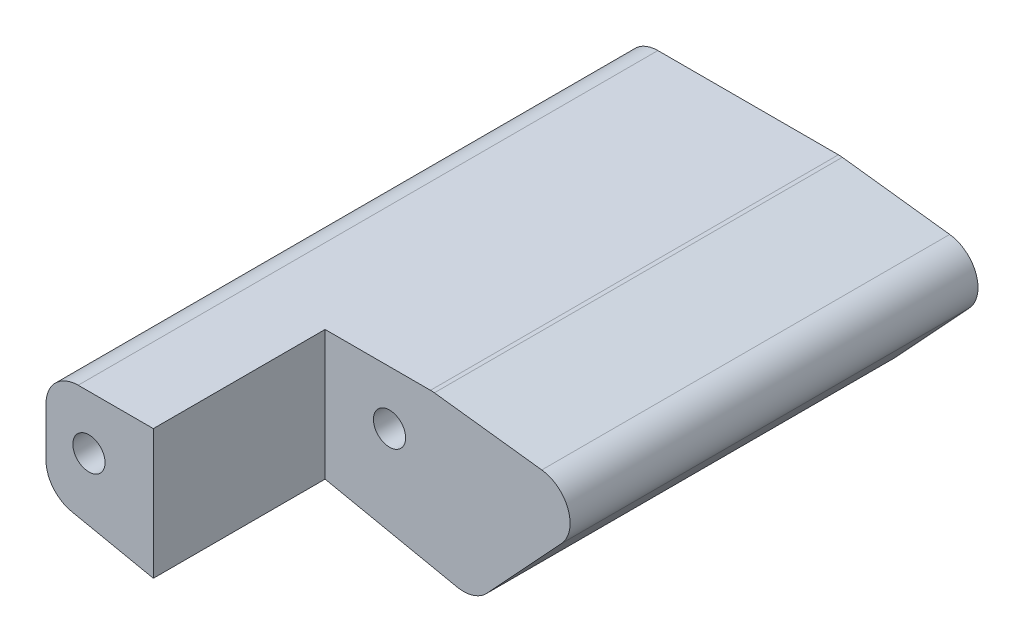
ISO-10303-21;
HEADER;
FILE_DESCRIPTION(('STEP AP214'),'2;1');
FILE_NAME('part.step','',(''),(''),'','','');
FILE_SCHEMA(('AUTOMOTIVE_DESIGN { 1 0 10303 214 1 1 1 1 }'));
ENDSEC;
DATA;
#1=APPLICATION_CONTEXT('core data for automotive mechanical design processes');
#2=APPLICATION_PROTOCOL_DEFINITION('international standard','automotive_design',2000,#1);
#3=PRODUCT_CONTEXT('',#1,'mechanical');
#4=PRODUCT('Part','Part','',(#3));
#5=PRODUCT_RELATED_PRODUCT_CATEGORY('part','',(#4));
#6=PRODUCT_DEFINITION_FORMATION('','',#4);
#7=PRODUCT_DEFINITION_CONTEXT('part definition',#1,'design');
#8=PRODUCT_DEFINITION('design','',#6,#7);
#9=PRODUCT_DEFINITION_SHAPE('','',#8);
#10=(LENGTH_UNIT() NAMED_UNIT(*) SI_UNIT(.MILLI.,.METRE.));
#11=(NAMED_UNIT(*) PLANE_ANGLE_UNIT() SI_UNIT($,.RADIAN.));
#12=(NAMED_UNIT(*) SI_UNIT($,.STERADIAN.) SOLID_ANGLE_UNIT());
#13=UNCERTAINTY_MEASURE_WITH_UNIT(LENGTH_MEASURE(1.E-05),#10,'distance_accuracy_value','');
#14=(GEOMETRIC_REPRESENTATION_CONTEXT(3) GLOBAL_UNCERTAINTY_ASSIGNED_CONTEXT((#13)) GLOBAL_UNIT_ASSIGNED_CONTEXT((#10,
#11,#12)) REPRESENTATION_CONTEXT('',''));
#15=CARTESIAN_POINT('',(0.,0.,0.));
#16=DIRECTION('',(0.,0.,1.));
#17=DIRECTION('',(1.,0.,0.));
#18=AXIS2_PLACEMENT_3D('',#15,#16,#17);
#19=CARTESIAN_POINT('',(6.,0.,54.));
#20=DIRECTION('',(0.,0.,-1.));
#21=DIRECTION('',(-1.,0.,0.));
#22=AXIS2_PLACEMENT_3D('',#19,#20,#21);
#23=CYLINDRICAL_SURFACE('',#22,1.5);
#24=CARTESIAN_POINT('',(6.,0.,0.));
#25=DIRECTION('',(0.,0.,1.));
#26=DIRECTION('',(1.,0.,0.));
#27=AXIS2_PLACEMENT_3D('',#24,#25,#26);
#28=CIRCLE('',#27,1.5);
#29=CARTESIAN_POINT('',(7.5,0.,0.));
#30=VERTEX_POINT('',#29);
#31=EDGE_CURVE('E175',#30,#30,#28,.T.);
#32=ORIENTED_EDGE('',*,*,#31,.F.);
#33=EDGE_LOOP('',(#32));
#34=FACE_BOUND('',#33,.T.);
#35=CARTESIAN_POINT('',(6.,0.,38.));
#36=DIRECTION('',(0.,0.,1.));
#37=DIRECTION('',(1.,0.,0.));
#38=AXIS2_PLACEMENT_3D('',#35,#36,#37);
#39=CIRCLE('',#38,1.5);
#40=CARTESIAN_POINT('',(7.5,0.,38.));
#41=VERTEX_POINT('',#40);
#42=EDGE_CURVE('E152',#41,#41,#39,.F.);
#43=ORIENTED_EDGE('',*,*,#42,.F.);
#44=EDGE_LOOP('',(#43));
#45=FACE_BOUND('',#44,.T.);
#46=ADVANCED_FACE('F45',(#34,#45),#23,.F.);
#47=CARTESIAN_POINT('',(0.747830971455452,6.12891975010285,93.0056560697374));
#48=DIRECTION('',(-0.12111848625343,-0.992638057041779,0.));
#49=DIRECTION('',(0.992638057041779,-0.12111848625343,0.));
#50=AXIS2_PLACEMENT_3D('',#47,#48,#49);
#51=PLANE('',#50);
#52=DIRECTION('',(-0.992638057041779,0.12111848625343,0.));
#53=VECTOR('',#52,1.);
#54=CARTESIAN_POINT('',(0.747830971455452,6.12891975010285,38.));
#55=LINE('',#54,#53);
#56=CARTESIAN_POINT('',(20.1849463760428,3.75726577387638,38.));
#57=VERTEX_POINT('',#56);
#58=CARTESIAN_POINT('',(10.1810065080935,4.97791417112534,38.));
#59=VERTEX_POINT('',#58);
#60=EDGE_CURVE('E161',#57,#59,#55,.T.);
#61=ORIENTED_EDGE('',*,*,#60,.F.);
#62=DIRECTION('',(0.,0.,-1.));
#63=VECTOR('',#62,1.);
#64=CARTESIAN_POINT('',(20.1849463760428,3.75726577387638,93.0056560697374));
#65=LINE('',#64,#63);
#66=CARTESIAN_POINT('',(20.1849463760428,3.75726577387638,0.));
#67=VERTEX_POINT('',#66);
#68=EDGE_CURVE('E207',#57,#67,#65,.T.);
#69=ORIENTED_EDGE('',*,*,#68,.T.);
#70=DIRECTION('',(-0.992638057041779,0.12111848625343,0.));
#71=VECTOR('',#70,1.);
#72=CARTESIAN_POINT('',(0.747830971455452,6.12891975010285,0.));
#73=LINE('',#72,#71);
#74=CARTESIAN_POINT('',(10.1810065080935,4.97791417112534,0.));
#75=VERTEX_POINT('',#74);
#76=EDGE_CURVE('E159',#67,#75,#73,.T.);
#77=ORIENTED_EDGE('',*,*,#76,.T.);
#78=DIRECTION('',(0.,0.,-1.));
#79=VECTOR('',#78,1.);
#80=CARTESIAN_POINT('',(10.1810065080935,4.97791417112534,93.0056560697374));
#81=LINE('',#80,#79);
#82=EDGE_CURVE('E209',#75,#59,#81,.F.);
#83=ORIENTED_EDGE('',*,*,#82,.T.);
#84=EDGE_LOOP('',(#61,#69,#77,#83));
#85=FACE_BOUND('',#84,.T.);
#86=ADVANCED_FACE('F265',(#85),#51,.F.);
#87=CARTESIAN_POINT('',(12.4641454877391,-11.5627606430357,93.0056560697374));
#88=DIRECTION('',(-0.733118624306535,0.680100788629813,0.));
#89=DIRECTION('',(-0.680100788629813,-0.733118624306535,0.));
#90=AXIS2_PLACEMENT_3D('',#87,#88,#89);
#91=PLANE('',#90);
#92=DIRECTION('',(0.680100788629813,0.733118624306535,0.));
#93=VECTOR('',#92,1.);
#94=CARTESIAN_POINT('',(12.4641454877391,-11.5627606430357,38.));
#95=LINE('',#94,#93);
#96=CARTESIAN_POINT('',(15.0881426885627,-8.73420750765765,38.));
#97=VERTEX_POINT('',#96);
#98=CARTESIAN_POINT('',(22.0209467902022,-1.26095076313839,38.));
#99=VERTEX_POINT('',#98);
#100=EDGE_CURVE('E60',#97,#99,#95,.T.);
#101=ORIENTED_EDGE('',*,*,#100,.F.);
#102=DIRECTION('',(0.,0.,-1.));
#103=VECTOR('',#102,1.);
#104=CARTESIAN_POINT('',(15.0881426885627,-8.73420750765765,93.0056560697374));
#105=LINE('',#104,#103);
#106=CARTESIAN_POINT('',(15.0881426885627,-8.73420750765765,0.));
#107=VERTEX_POINT('',#106);
#108=EDGE_CURVE('E11',#97,#107,#105,.T.);
#109=ORIENTED_EDGE('',*,*,#108,.T.);
#110=DIRECTION('',(0.680100788629813,0.733118624306535,0.));
#111=VECTOR('',#110,1.);
#112=CARTESIAN_POINT('',(12.4641454877391,-11.5627606430357,0.));
#113=LINE('',#112,#111);
#114=CARTESIAN_POINT('',(22.0209467902022,-1.26095076313839,0.));
#115=VERTEX_POINT('',#114);
#116=EDGE_CURVE('E168',#107,#115,#113,.T.);
#117=ORIENTED_EDGE('',*,*,#116,.T.);
#118=DIRECTION('',(0.,0.,-1.));
#119=VECTOR('',#118,1.);
#120=CARTESIAN_POINT('',(22.0209467902022,-1.26095076313839,93.0056560697374));
#121=LINE('',#120,#119);
#122=EDGE_CURVE('E53',#115,#99,#121,.F.);
#123=ORIENTED_EDGE('',*,*,#122,.T.);
#124=EDGE_LOOP('',(#101,#109,#117,#123));
#125=FACE_BOUND('',#124,.T.);
#126=ADVANCED_FACE('F228',(#125),#91,.F.);
#127=CARTESIAN_POINT('',(9.81765104933319,2.,54.));
#128=DIRECTION('',(0.,0.,-1.));
#129=DIRECTION('',(-1.,0.,0.));
#130=AXIS2_PLACEMENT_3D('',#127,#128,#129);
#131=CYLINDRICAL_SURFACE('',#130,3.);
#132=DIRECTION('',(0.,0.,-1.));
#133=VECTOR('',#132,1.);
#134=CARTESIAN_POINT('',(9.81765104933319,5.,54.));
#135=LINE('',#134,#133);
#136=CARTESIAN_POINT('',(9.81765104933319,5.,38.));
#137=VERTEX_POINT('',#136);
#138=CARTESIAN_POINT('',(9.81765104933319,5.,0.));
#139=VERTEX_POINT('',#138);
#140=EDGE_CURVE('E195',#137,#139,#135,.T.);
#141=ORIENTED_EDGE('',*,*,#140,.F.);
#142=CARTESIAN_POINT('',(9.81765104933319,2.,38.));
#143=DIRECTION('',(0.,0.,1.));
#144=DIRECTION('',(1.,0.,0.));
#145=AXIS2_PLACEMENT_3D('',#142,#143,#144);
#146=CIRCLE('',#145,3.);
#147=EDGE_CURVE('E149',#59,#137,#146,.T.);
#148=ORIENTED_EDGE('',*,*,#147,.F.);
#149=ORIENTED_EDGE('',*,*,#82,.F.);
#150=CARTESIAN_POINT('',(9.81765104933319,2.,0.));
#151=DIRECTION('',(0.,0.,1.));
#152=DIRECTION('',(1.,0.,0.));
#153=AXIS2_PLACEMENT_3D('',#150,#151,#152);
#154=CIRCLE('',#153,3.);
#155=EDGE_CURVE('E205',#139,#75,#154,.F.);
#156=ORIENTED_EDGE('',*,*,#155,.F.);
#157=EDGE_LOOP('',(#141,#148,#149,#156));
#158=FACE_BOUND('',#157,.T.);
#159=ADVANCED_FACE('F267',(#158),#131,.T.);
#160=CARTESIAN_POINT('',(12.8887868156431,-6.69390514176821,93.0056560697374));
#161=DIRECTION('',(0.,0.,-1.));
#162=DIRECTION('',(-1.,0.,0.));
#163=AXIS2_PLACEMENT_3D('',#160,#161,#162);
#164=CYLINDRICAL_SURFACE('',#163,3.);
#165=ORIENTED_EDGE('',*,*,#108,.F.);
#166=CARTESIAN_POINT('',(12.8887868156431,-6.69390514176821,38.));
#167=DIRECTION('',(0.,0.,1.));
#168=DIRECTION('',(1.,0.,0.));
#169=AXIS2_PLACEMENT_3D('',#166,#167,#168);
#170=CIRCLE('',#169,3.);
#171=CARTESIAN_POINT('',(12.2782104026823,-9.63111409653053,38.));
#172=VERTEX_POINT('',#171);
#173=EDGE_CURVE('E239',#172,#97,#170,.T.);
#174=ORIENTED_EDGE('',*,*,#173,.F.);
#175=DIRECTION('',(0.,0.,-1.));
#176=VECTOR('',#175,1.);
#177=CARTESIAN_POINT('',(12.2782104026823,-9.63111409653053,93.0056560697374));
#178=LINE('',#177,#176);
#179=CARTESIAN_POINT('',(12.2782104026823,-9.63111409653053,0.));
#180=VERTEX_POINT('',#179);
#181=EDGE_CURVE('E220',#180,#172,#178,.F.);
#182=ORIENTED_EDGE('',*,*,#181,.F.);
#183=CARTESIAN_POINT('',(12.8887868156431,-6.69390514176821,0.));
#184=DIRECTION('',(0.,0.,1.));
#185=DIRECTION('',(1.,0.,0.));
#186=AXIS2_PLACEMENT_3D('',#183,#184,#185);
#187=CIRCLE('',#186,3.);
#188=EDGE_CURVE('E199',#107,#180,#187,.F.);
#189=ORIENTED_EDGE('',*,*,#188,.F.);
#190=EDGE_LOOP('',(#165,#174,#182,#189));
#191=FACE_BOUND('',#190,.T.);
#192=ADVANCED_FACE('F251',(#191),#164,.T.);
#193=CARTESIAN_POINT('',(19.8215909172826,0.779351602751047,93.0056560697374));
#194=DIRECTION('',(0.,0.,-1.));
#195=DIRECTION('',(-1.,0.,0.));
#196=AXIS2_PLACEMENT_3D('',#193,#194,#195);
#197=CYLINDRICAL_SURFACE('',#196,3.);
#198=ORIENTED_EDGE('',*,*,#68,.F.);
#199=CARTESIAN_POINT('',(19.8215909172826,0.779351602751047,38.));
#200=DIRECTION('',(0.,0.,1.));
#201=DIRECTION('',(1.,0.,0.));
#202=AXIS2_PLACEMENT_3D('',#199,#200,#201);
#203=CIRCLE('',#202,3.);
#204=EDGE_CURVE('E235',#99,#57,#203,.T.);
#205=ORIENTED_EDGE('',*,*,#204,.F.);
#206=ORIENTED_EDGE('',*,*,#122,.F.);
#207=CARTESIAN_POINT('',(19.8215909172826,0.779351602751047,0.));
#208=DIRECTION('',(0.,0.,1.));
#209=DIRECTION('',(1.,0.,0.));
#210=AXIS2_PLACEMENT_3D('',#207,#208,#209);
#211=CIRCLE('',#210,3.);
#212=EDGE_CURVE('E197',#67,#115,#211,.F.);
#213=ORIENTED_EDGE('',*,*,#212,.F.);
#214=EDGE_LOOP('',(#198,#205,#206,#213));
#215=FACE_BOUND('',#214,.T.);
#216=ADVANCED_FACE('F47',(#215),#197,.T.);
#217=CARTESIAN_POINT('',(0.,0.,54.));
#218=DIRECTION('',(0.,0.,1.));
#219=DIRECTION('',(1.,0.,0.));
#220=AXIS2_PLACEMENT_3D('',#217,#218,#219);
#221=PLANE('',#220);
#222=DIRECTION('',(0.,-1.,0.));
#223=VECTOR('',#222,1.);
#224=CARTESIAN_POINT('',(0.,0.,54.));
#225=LINE('',#224,#223);
#226=CARTESIAN_POINT('',(0.,5.,54.));
#227=VERTEX_POINT('',#226);
#228=CARTESIAN_POINT('',(0.,-7.07876396390122,54.));
#229=VERTEX_POINT('',#228);
#230=EDGE_CURVE('E242',#227,#229,#225,.T.);
#231=ORIENTED_EDGE('',*,*,#230,.F.);
#232=DIRECTION('',(-1.,0.,0.));
#233=VECTOR('',#232,1.);
#234=CARTESIAN_POINT('',(-10.,5.,54.));
#235=LINE('',#234,#233);
#236=CARTESIAN_POINT('',(-7.,5.,54.));
#237=VERTEX_POINT('',#236);
#238=EDGE_CURVE('E157',#227,#237,#235,.T.);
#239=ORIENTED_EDGE('',*,*,#238,.T.);
#240=CARTESIAN_POINT('',(-7.,2.,54.));
#241=DIRECTION('',(0.,0.,1.));
#242=DIRECTION('',(1.,0.,0.));
#243=AXIS2_PLACEMENT_3D('',#240,#241,#242);
#244=CIRCLE('',#243,3.);
#245=CARTESIAN_POINT('',(-10.,2.,54.));
#246=VERTEX_POINT('',#245);
#247=EDGE_CURVE('E213',#237,#246,#244,.T.);
#248=ORIENTED_EDGE('',*,*,#247,.T.);
#249=DIRECTION('',(0.,-1.,0.));
#250=VECTOR('',#249,1.);
#251=CARTESIAN_POINT('',(-10.,5.,54.));
#252=LINE('',#251,#250);
#253=CARTESIAN_POINT('',(-10.,-2.55949580996095,54.));
#254=VERTEX_POINT('',#253);
#255=EDGE_CURVE('E186',#246,#254,#252,.T.);
#256=ORIENTED_EDGE('',*,*,#255,.T.);
#257=CARTESIAN_POINT('',(-7.,-2.55949580996095,54.));
#258=DIRECTION('',(0.,0.,1.));
#259=DIRECTION('',(1.,0.,0.));
#260=AXIS2_PLACEMENT_3D('',#257,#258,#259);
#261=CIRCLE('',#260,3.);
#262=CARTESIAN_POINT('',(-7.61057641296079,-5.49670476472327,54.));
#263=VERTEX_POINT('',#262);
#264=EDGE_CURVE('E68',#254,#263,#261,.T.);
#265=ORIENTED_EDGE('',*,*,#264,.T.);
#266=DIRECTION('',(0.979069651587439,-0.203525470986929,0.));
#267=VECTOR('',#266,1.);
#268=CARTESIAN_POINT('',(-1.41055423324622,-6.78554303298116,54.));
#269=LINE('',#268,#267);
#270=EDGE_CURVE('E171',#263,#229,#269,.T.);
#271=ORIENTED_EDGE('',*,*,#270,.T.);
#272=EDGE_LOOP('',(#231,#239,#248,#256,#265,#271));
#273=FACE_BOUND('',#272,.T.);
#274=CARTESIAN_POINT('',(-6.,0.,54.));
#275=DIRECTION('',(0.,0.,1.));
#276=DIRECTION('',(1.,0.,0.));
#277=AXIS2_PLACEMENT_3D('',#274,#275,#276);
#278=CIRCLE('',#277,1.5);
#279=CARTESIAN_POINT('',(-4.5,0.,54.));
#280=VERTEX_POINT('',#279);
#281=EDGE_CURVE('E179',#280,#280,#278,.T.);
#282=ORIENTED_EDGE('',*,*,#281,.F.);
#283=EDGE_LOOP('',(#282));
#284=FACE_BOUND('',#283,.T.);
#285=ADVANCED_FACE('F274',(#273,#284),#221,.T.);
#286=CARTESIAN_POINT('',(0.,0.,0.));
#287=DIRECTION('',(0.,0.,1.));
#288=DIRECTION('',(1.,0.,0.));
#289=AXIS2_PLACEMENT_3D('',#286,#287,#288);
#290=PLANE('',#289);
#291=DIRECTION('',(-1.,0.,0.));
#292=VECTOR('',#291,1.);
#293=CARTESIAN_POINT('',(-10.,5.,0.));
#294=LINE('',#293,#292);
#295=CARTESIAN_POINT('',(-7.,5.,0.));
#296=VERTEX_POINT('',#295);
#297=EDGE_CURVE('E182',#139,#296,#294,.T.);
#298=ORIENTED_EDGE('',*,*,#297,.F.);
#299=ORIENTED_EDGE('',*,*,#155,.T.);
#300=ORIENTED_EDGE('',*,*,#76,.F.);
#301=ORIENTED_EDGE('',*,*,#212,.T.);
#302=ORIENTED_EDGE('',*,*,#116,.F.);
#303=ORIENTED_EDGE('',*,*,#188,.T.);
#304=DIRECTION('',(0.979069651587439,-0.203525470986929,0.));
#305=VECTOR('',#304,1.);
#306=CARTESIAN_POINT('',(-1.41055423324622,-6.78554303298116,0.));
#307=LINE('',#306,#305);
#308=CARTESIAN_POINT('',(-7.61057641296079,-5.49670476472327,0.));
#309=VERTEX_POINT('',#308);
#310=EDGE_CURVE('E165',#309,#180,#307,.T.);
#311=ORIENTED_EDGE('',*,*,#310,.F.);
#312=CARTESIAN_POINT('',(-7.,-2.55949580996095,0.));
#313=DIRECTION('',(0.,0.,1.));
#314=DIRECTION('',(1.,0.,0.));
#315=AXIS2_PLACEMENT_3D('',#312,#313,#314);
#316=CIRCLE('',#315,3.);
#317=CARTESIAN_POINT('',(-10.,-2.55949580996095,0.));
#318=VERTEX_POINT('',#317);
#319=EDGE_CURVE('E201',#309,#318,#316,.F.);
#320=ORIENTED_EDGE('',*,*,#319,.T.);
#321=DIRECTION('',(0.,-1.,0.));
#322=VECTOR('',#321,1.);
#323=CARTESIAN_POINT('',(-10.,5.,0.));
#324=LINE('',#323,#322);
#325=CARTESIAN_POINT('',(-10.,2.,0.));
#326=VERTEX_POINT('',#325);
#327=EDGE_CURVE('E187',#326,#318,#324,.T.);
#328=ORIENTED_EDGE('',*,*,#327,.F.);
#329=CARTESIAN_POINT('',(-7.,2.,0.));
#330=DIRECTION('',(0.,0.,1.));
#331=DIRECTION('',(1.,0.,0.));
#332=AXIS2_PLACEMENT_3D('',#329,#330,#331);
#333=CIRCLE('',#332,3.);
#334=EDGE_CURVE('E203',#326,#296,#333,.F.);
#335=ORIENTED_EDGE('',*,*,#334,.T.);
#336=EDGE_LOOP('',(#298,#299,#300,#301,#302,#303,#311,#320,#328,#335));
#337=FACE_BOUND('',#336,.T.);
#338=CARTESIAN_POINT('',(-6.,0.,0.));
#339=DIRECTION('',(0.,0.,1.));
#340=DIRECTION('',(1.,0.,0.));
#341=AXIS2_PLACEMENT_3D('',#338,#339,#340);
#342=CIRCLE('',#341,1.5);
#343=CARTESIAN_POINT('',(-4.5,0.,0.));
#344=VERTEX_POINT('',#343);
#345=EDGE_CURVE('E178',#344,#344,#342,.T.);
#346=ORIENTED_EDGE('',*,*,#345,.T.);
#347=EDGE_LOOP('',(#346));
#348=FACE_BOUND('',#347,.T.);
#349=ORIENTED_EDGE('',*,*,#31,.T.);
#350=EDGE_LOOP('',(#349));
#351=FACE_BOUND('',#350,.T.);
#352=ADVANCED_FACE('F259',(#337,#348,#351),#290,.F.);
#353=CARTESIAN_POINT('',(-10.,5.,54.));
#354=DIRECTION('',(0.,-1.,0.));
#355=DIRECTION('',(0.,0.,-1.));
#356=AXIS2_PLACEMENT_3D('',#353,#354,#355);
#357=PLANE('',#356);
#358=ORIENTED_EDGE('',*,*,#238,.F.);
#359=DIRECTION('',(0.,0.,1.));
#360=VECTOR('',#359,1.);
#361=CARTESIAN_POINT('',(0.,5.,38.));
#362=LINE('',#361,#360);
#363=CARTESIAN_POINT('',(0.,5.,38.));
#364=VERTEX_POINT('',#363);
#365=EDGE_CURVE('E138',#364,#227,#362,.T.);
#366=ORIENTED_EDGE('',*,*,#365,.F.);
#367=DIRECTION('',(-1.,0.,0.));
#368=VECTOR('',#367,1.);
#369=CARTESIAN_POINT('',(0.,5.,38.));
#370=LINE('',#369,#368);
#371=EDGE_CURVE('E144',#137,#364,#370,.T.);
#372=ORIENTED_EDGE('',*,*,#371,.F.);
#373=ORIENTED_EDGE('',*,*,#140,.T.);
#374=ORIENTED_EDGE('',*,*,#297,.T.);
#375=DIRECTION('',(0.,0.,-1.));
#376=VECTOR('',#375,1.);
#377=CARTESIAN_POINT('',(-7.,5.,54.));
#378=LINE('',#377,#376);
#379=EDGE_CURVE('E189',#296,#237,#378,.F.);
#380=ORIENTED_EDGE('',*,*,#379,.T.);
#381=EDGE_LOOP('',(#358,#366,#372,#373,#374,#380));
#382=FACE_BOUND('',#381,.T.);
#383=ADVANCED_FACE('F155',(#382),#357,.F.);
#384=CARTESIAN_POINT('',(-10.,5.,54.));
#385=DIRECTION('',(1.,0.,0.));
#386=DIRECTION('',(0.,0.,-1.));
#387=AXIS2_PLACEMENT_3D('',#384,#385,#386);
#388=PLANE('',#387);
#389=ORIENTED_EDGE('',*,*,#255,.F.);
#390=DIRECTION('',(0.,0.,-1.));
#391=VECTOR('',#390,1.);
#392=CARTESIAN_POINT('',(-10.,2.,54.));
#393=LINE('',#392,#391);
#394=EDGE_CURVE('E217',#246,#326,#393,.T.);
#395=ORIENTED_EDGE('',*,*,#394,.T.);
#396=ORIENTED_EDGE('',*,*,#327,.T.);
#397=DIRECTION('',(0.,0.,-1.));
#398=VECTOR('',#397,1.);
#399=CARTESIAN_POINT('',(-10.,-2.55949580996095,54.));
#400=LINE('',#399,#398);
#401=EDGE_CURVE('E215',#318,#254,#400,.F.);
#402=ORIENTED_EDGE('',*,*,#401,.T.);
#403=EDGE_LOOP('',(#389,#395,#396,#402));
#404=FACE_BOUND('',#403,.T.);
#405=ADVANCED_FACE('F277',(#404),#388,.F.);
#406=CARTESIAN_POINT('',(-6.,0.,54.));
#407=DIRECTION('',(0.,0.,-1.));
#408=DIRECTION('',(-1.,0.,0.));
#409=AXIS2_PLACEMENT_3D('',#406,#407,#408);
#410=CYLINDRICAL_SURFACE('',#409,1.5);
#411=ORIENTED_EDGE('',*,*,#281,.T.);
#412=EDGE_LOOP('',(#411));
#413=FACE_BOUND('',#412,.T.);
#414=ORIENTED_EDGE('',*,*,#345,.F.);
#415=EDGE_LOOP('',(#414));
#416=FACE_BOUND('',#415,.T.);
#417=ADVANCED_FACE('F300',(#413,#416),#410,.F.);
#418=CARTESIAN_POINT('',(-1.41055423324622,-6.78554303298116,93.0056560697374));
#419=DIRECTION('',(0.203525470986929,0.979069651587439,0.));
#420=DIRECTION('',(-0.979069651587439,0.203525470986929,0.));
#421=AXIS2_PLACEMENT_3D('',#418,#419,#420);
#422=PLANE('',#421);
#423=DIRECTION('',(0.979069651587439,-0.203525470986929,0.));
#424=VECTOR('',#423,1.);
#425=CARTESIAN_POINT('',(-1.41055423324622,-6.78554303298116,38.));
#426=LINE('',#425,#424);
#427=CARTESIAN_POINT('',(0.,-7.07876396390122,38.));
#428=VERTEX_POINT('',#427);
#429=EDGE_CURVE('E143',#428,#172,#426,.T.);
#430=ORIENTED_EDGE('',*,*,#429,.F.);
#431=DIRECTION('',(0.,0.,1.));
#432=VECTOR('',#431,1.);
#433=CARTESIAN_POINT('',(0.,-7.07876396390122,38.));
#434=LINE('',#433,#432);
#435=EDGE_CURVE('E141',#428,#229,#434,.T.);
#436=ORIENTED_EDGE('',*,*,#435,.T.);
#437=ORIENTED_EDGE('',*,*,#270,.F.);
#438=DIRECTION('',(0.,0.,-1.));
#439=VECTOR('',#438,1.);
#440=CARTESIAN_POINT('',(-7.61057641296079,-5.49670476472327,93.0056560697374));
#441=LINE('',#440,#439);
#442=EDGE_CURVE('E223',#263,#309,#441,.T.);
#443=ORIENTED_EDGE('',*,*,#442,.T.);
#444=ORIENTED_EDGE('',*,*,#310,.T.);
#445=ORIENTED_EDGE('',*,*,#181,.T.);
#446=EDGE_LOOP('',(#430,#436,#437,#443,#444,#445));
#447=FACE_BOUND('',#446,.T.);
#448=ADVANCED_FACE('F254',(#447),#422,.F.);
#449=CARTESIAN_POINT('',(-7.,2.,54.));
#450=DIRECTION('',(0.,0.,-1.));
#451=DIRECTION('',(-1.,0.,0.));
#452=AXIS2_PLACEMENT_3D('',#449,#450,#451);
#453=CYLINDRICAL_SURFACE('',#452,3.);
#454=ORIENTED_EDGE('',*,*,#247,.F.);
#455=ORIENTED_EDGE('',*,*,#379,.F.);
#456=ORIENTED_EDGE('',*,*,#334,.F.);
#457=ORIENTED_EDGE('',*,*,#394,.F.);
#458=EDGE_LOOP('',(#454,#455,#456,#457));
#459=FACE_BOUND('',#458,.T.);
#460=ADVANCED_FACE('F271',(#459),#453,.T.);
#461=CARTESIAN_POINT('',(-7.,-2.55949580996095,93.0056560697374));
#462=DIRECTION('',(0.,0.,-1.));
#463=DIRECTION('',(-1.,0.,0.));
#464=AXIS2_PLACEMENT_3D('',#461,#462,#463);
#465=CYLINDRICAL_SURFACE('',#464,3.);
#466=ORIENTED_EDGE('',*,*,#264,.F.);
#467=ORIENTED_EDGE('',*,*,#401,.F.);
#468=ORIENTED_EDGE('',*,*,#319,.F.);
#469=ORIENTED_EDGE('',*,*,#442,.F.);
#470=EDGE_LOOP('',(#466,#467,#468,#469));
#471=FACE_BOUND('',#470,.T.);
#472=ADVANCED_FACE('F280',(#471),#465,.T.);
#473=CARTESIAN_POINT('',(0.,0.,38.));
#474=DIRECTION('',(-1.,0.,0.));
#475=DIRECTION('',(0.,0.,1.));
#476=AXIS2_PLACEMENT_3D('',#473,#474,#475);
#477=PLANE('',#476);
#478=ORIENTED_EDGE('',*,*,#230,.T.);
#479=ORIENTED_EDGE('',*,*,#435,.F.);
#480=DIRECTION('',(0.,-1.,0.));
#481=VECTOR('',#480,1.);
#482=CARTESIAN_POINT('',(0.,0.,38.));
#483=LINE('',#482,#481);
#484=EDGE_CURVE('E134',#364,#428,#483,.T.);
#485=ORIENTED_EDGE('',*,*,#484,.F.);
#486=ORIENTED_EDGE('',*,*,#365,.T.);
#487=EDGE_LOOP('',(#478,#479,#485,#486));
#488=FACE_BOUND('',#487,.T.);
#489=ADVANCED_FACE('F136',(#488),#477,.F.);
#490=CARTESIAN_POINT('',(0.,0.,38.));
#491=DIRECTION('',(0.,0.,1.));
#492=DIRECTION('',(1.,0.,0.));
#493=AXIS2_PLACEMENT_3D('',#490,#491,#492);
#494=PLANE('',#493);
#495=ORIENTED_EDGE('',*,*,#42,.T.);
#496=EDGE_LOOP('',(#495));
#497=FACE_BOUND('',#496,.T.);
#498=ORIENTED_EDGE('',*,*,#371,.T.);
#499=ORIENTED_EDGE('',*,*,#484,.T.);
#500=ORIENTED_EDGE('',*,*,#429,.T.);
#501=ORIENTED_EDGE('',*,*,#173,.T.);
#502=ORIENTED_EDGE('',*,*,#100,.T.);
#503=ORIENTED_EDGE('',*,*,#204,.T.);
#504=ORIENTED_EDGE('',*,*,#60,.T.);
#505=ORIENTED_EDGE('',*,*,#147,.T.);
#506=EDGE_LOOP('',(#498,#499,#500,#501,#502,#503,#504,#505));
#507=FACE_BOUND('',#506,.T.);
#508=ADVANCED_FACE('F147',(#497,#507),#494,.T.);
#509=CLOSED_SHELL('',(#46,#86,#126,#159,#192,#216,#285,#352,#383,#405,#417,#448,#460,#472,#489,#508));
#510=MANIFOLD_SOLID_BREP('B2',#509);
#511=ADVANCED_BREP_SHAPE_REPRESENTATION('',(#18,#510),#14);
#512=SHAPE_DEFINITION_REPRESENTATION(#9,#511);
ENDSEC;
END-ISO-10303-21;
